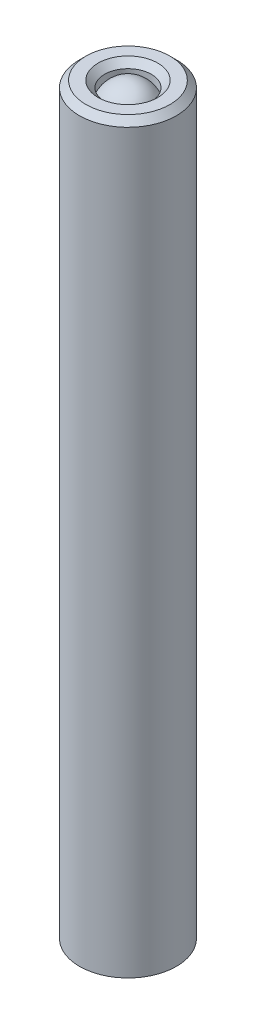
ISO-10303-21;
HEADER;
FILE_DESCRIPTION(('STEP AP214'),'2;1');
FILE_NAME('part.step','',(''),(''),'','','');
FILE_SCHEMA(('AUTOMOTIVE_DESIGN { 1 0 10303 214 1 1 1 1 }'));
ENDSEC;
DATA;
#1=APPLICATION_CONTEXT('core data for automotive mechanical design processes');
#2=APPLICATION_PROTOCOL_DEFINITION('international standard','automotive_design',2000,#1);
#3=PRODUCT_CONTEXT('',#1,'mechanical');
#4=PRODUCT('Part','Part','',(#3));
#5=PRODUCT_RELATED_PRODUCT_CATEGORY('part','',(#4));
#6=PRODUCT_DEFINITION_FORMATION('','',#4);
#7=PRODUCT_DEFINITION_CONTEXT('part definition',#1,'design');
#8=PRODUCT_DEFINITION('design','',#6,#7);
#9=PRODUCT_DEFINITION_SHAPE('','',#8);
#10=(LENGTH_UNIT() NAMED_UNIT(*) SI_UNIT(.MILLI.,.METRE.));
#11=(NAMED_UNIT(*) PLANE_ANGLE_UNIT() SI_UNIT($,.RADIAN.));
#12=(NAMED_UNIT(*) SI_UNIT($,.STERADIAN.) SOLID_ANGLE_UNIT());
#13=UNCERTAINTY_MEASURE_WITH_UNIT(LENGTH_MEASURE(1.E-05),#10,'distance_accuracy_value','');
#14=(GEOMETRIC_REPRESENTATION_CONTEXT(3) GLOBAL_UNCERTAINTY_ASSIGNED_CONTEXT((#13)) GLOBAL_UNIT_ASSIGNED_CONTEXT((#10,
#11,#12)) REPRESENTATION_CONTEXT('',''));
#15=CARTESIAN_POINT('',(0.,0.,0.));
#16=DIRECTION('',(0.,0.,1.));
#17=DIRECTION('',(1.,0.,0.));
#18=AXIS2_PLACEMENT_3D('',#15,#16,#17);
#19=CARTESIAN_POINT('',(0.,115.,0.));
#20=DIRECTION('',(0.,-1.,0.));
#21=DIRECTION('',(0.,0.,-1.));
#22=AXIS2_PLACEMENT_3D('',#19,#20,#21);
#23=CYLINDRICAL_SURFACE('',#22,7.5);
#24=CARTESIAN_POINT('',(0.,114.,0.));
#25=DIRECTION('',(0.,1.,0.));
#26=DIRECTION('',(0.,0.,1.));
#27=AXIS2_PLACEMENT_3D('',#24,#25,#26);
#28=CIRCLE('',#27,7.5);
#29=CARTESIAN_POINT('',(0.,114.,7.5));
#30=VERTEX_POINT('',#29);
#31=EDGE_CURVE('E47',#30,#30,#28,.F.);
#32=ORIENTED_EDGE('',*,*,#31,.T.);
#33=EDGE_LOOP('',(#32));
#34=FACE_BOUND('',#33,.T.);
#35=CARTESIAN_POINT('',(0.,0.,0.));
#36=DIRECTION('',(0.,1.,0.));
#37=DIRECTION('',(0.,0.,1.));
#38=AXIS2_PLACEMENT_3D('',#35,#36,#37);
#39=CIRCLE('',#38,7.5);
#40=CARTESIAN_POINT('',(0.,0.,7.5));
#41=VERTEX_POINT('',#40);
#42=EDGE_CURVE('E61',#41,#41,#39,.T.);
#43=ORIENTED_EDGE('',*,*,#42,.T.);
#44=EDGE_LOOP('',(#43));
#45=FACE_BOUND('',#44,.T.);
#46=ADVANCED_FACE('F39',(#34,#45),#23,.T.);
#47=CARTESIAN_POINT('',(0.,115.,0.));
#48=DIRECTION('',(0.,1.,0.));
#49=DIRECTION('',(0.,0.,1.));
#50=AXIS2_PLACEMENT_3D('',#47,#48,#49);
#51=PLANE('',#50);
#52=CARTESIAN_POINT('',(0.,115.,0.));
#53=DIRECTION('',(0.,1.,0.));
#54=DIRECTION('',(0.,0.,1.));
#55=AXIS2_PLACEMENT_3D('',#52,#53,#54);
#56=CIRCLE('',#55,6.50000000000001);
#57=CARTESIAN_POINT('',(0.,115.,6.50000000000001));
#58=VERTEX_POINT('',#57);
#59=EDGE_CURVE('E71',#58,#58,#56,.T.);
#60=ORIENTED_EDGE('',*,*,#59,.T.);
#61=EDGE_LOOP('',(#60));
#62=FACE_BOUND('',#61,.T.);
#63=CARTESIAN_POINT('',(0.,115.,0.));
#64=DIRECTION('',(0.,1.,0.));
#65=DIRECTION('',(0.,0.,1.));
#66=AXIS2_PLACEMENT_3D('',#63,#64,#65);
#67=CIRCLE('',#66,4.61860157426119);
#68=CARTESIAN_POINT('',(0.,115.,4.61860157426119));
#69=VERTEX_POINT('',#68);
#70=EDGE_CURVE('E65',#69,#69,#67,.F.);
#71=ORIENTED_EDGE('',*,*,#70,.T.);
#72=EDGE_LOOP('',(#71));
#73=FACE_BOUND('',#72,.T.);
#74=ADVANCED_FACE('F84',(#62,#73),#51,.T.);
#75=CARTESIAN_POINT('',(0.,0.,0.));
#76=DIRECTION('',(0.,1.,0.));
#77=DIRECTION('',(0.,0.,1.));
#78=AXIS2_PLACEMENT_3D('',#75,#76,#77);
#79=PLANE('',#78);
#80=ORIENTED_EDGE('',*,*,#42,.F.);
#81=EDGE_LOOP('',(#80));
#82=FACE_BOUND('',#81,.T.);
#83=ADVANCED_FACE('F87',(#82),#79,.F.);
#84=CARTESIAN_POINT('',(0.,125.515236918763,0.));
#85=DIRECTION('',(0.,1.,0.));
#86=DIRECTION('',(0.,0.,1.));
#87=AXIS2_PLACEMENT_3D('',#84,#85,#86);
#88=CYLINDRICAL_SURFACE('',#87,3.61860157426117);
#89=CARTESIAN_POINT('',(0.,114.,0.));
#90=DIRECTION('',(0.,1.,0.));
#91=DIRECTION('',(0.,0.,1.));
#92=AXIS2_PLACEMENT_3D('',#89,#90,#91);
#93=CIRCLE('',#92,3.61860157426117);
#94=CARTESIAN_POINT('',(0.,114.,3.61860157426117));
#95=VERTEX_POINT('',#94);
#96=EDGE_CURVE('E11',#95,#95,#93,.T.);
#97=ORIENTED_EDGE('',*,*,#96,.T.);
#98=EDGE_LOOP('',(#97));
#99=FACE_BOUND('',#98,.T.);
#100=CARTESIAN_POINT('',(0.,112.704618035442,0.));
#101=DIRECTION('',(0.,1.,0.));
#102=DIRECTION('',(0.,0.,1.));
#103=AXIS2_PLACEMENT_3D('',#100,#101,#102);
#104=CIRCLE('',#103,3.61860157426117);
#105=CARTESIAN_POINT('',(0.,112.704618035442,3.61860157426117));
#106=VERTEX_POINT('',#105);
#107=EDGE_CURVE('E58',#106,#106,#104,.T.);
#108=ORIENTED_EDGE('',*,*,#107,.F.);
#109=EDGE_LOOP('',(#108));
#110=FACE_BOUND('',#109,.T.);
#111=ADVANCED_FACE('F54',(#99,#110),#88,.F.);
#112=CARTESIAN_POINT('',(0.,111.,0.));
#113=DIRECTION('',(0.,1.,0.));
#114=DIRECTION('',(-1.,0.,0.));
#115=AXIS2_PLACEMENT_3D('',#112,#113,#114);
#116=SPHERICAL_SURFACE('',#115,4.00000000000001);
#117=CARTESIAN_POINT('',(0.,115.,0.));
#118=VERTEX_POINT('',#117);
#119=VERTEX_LOOP('',#118);
#120=FACE_BOUND('',#119,.T.);
#121=ORIENTED_EDGE('',*,*,#107,.T.);
#122=EDGE_LOOP('',(#121));
#123=FACE_BOUND('',#122,.T.);
#124=ADVANCED_FACE('F50',(#120,#123),#116,.T.);
#125=CARTESIAN_POINT('',(0.,115.,0.));
#126=DIRECTION('',(0.,-1.,0.));
#127=DIRECTION('',(0.,0.,-1.));
#128=AXIS2_PLACEMENT_3D('',#125,#126,#127);
#129=CONICAL_SURFACE('',#128,6.50000000000001,0.785398163397452);
#130=ORIENTED_EDGE('',*,*,#31,.F.);
#131=EDGE_LOOP('',(#130));
#132=FACE_BOUND('',#131,.T.);
#133=ORIENTED_EDGE('',*,*,#59,.F.);
#134=EDGE_LOOP('',(#133));
#135=FACE_BOUND('',#134,.T.);
#136=ADVANCED_FACE('F53',(#132,#135),#129,.T.);
#137=CARTESIAN_POINT('',(0.,114.,0.));
#138=DIRECTION('',(0.,1.,0.));
#139=DIRECTION('',(0.,0.,1.));
#140=AXIS2_PLACEMENT_3D('',#137,#138,#139);
#141=CONICAL_SURFACE('',#140,3.61860157426117,0.785398163397452);
#142=ORIENTED_EDGE('',*,*,#70,.F.);
#143=EDGE_LOOP('',(#142));
#144=FACE_BOUND('',#143,.T.);
#145=ORIENTED_EDGE('',*,*,#96,.F.);
#146=EDGE_LOOP('',(#145));
#147=FACE_BOUND('',#146,.T.);
#148=ADVANCED_FACE('F41',(#144,#147),#141,.F.);
#149=CLOSED_SHELL('',(#46,#74,#83,#111,#124,#136,#148));
#150=MANIFOLD_SOLID_BREP('B2',#149);
#151=ADVANCED_BREP_SHAPE_REPRESENTATION('',(#18,#150),#14);
#152=SHAPE_DEFINITION_REPRESENTATION(#9,#151);
ENDSEC;
END-ISO-10303-21;
